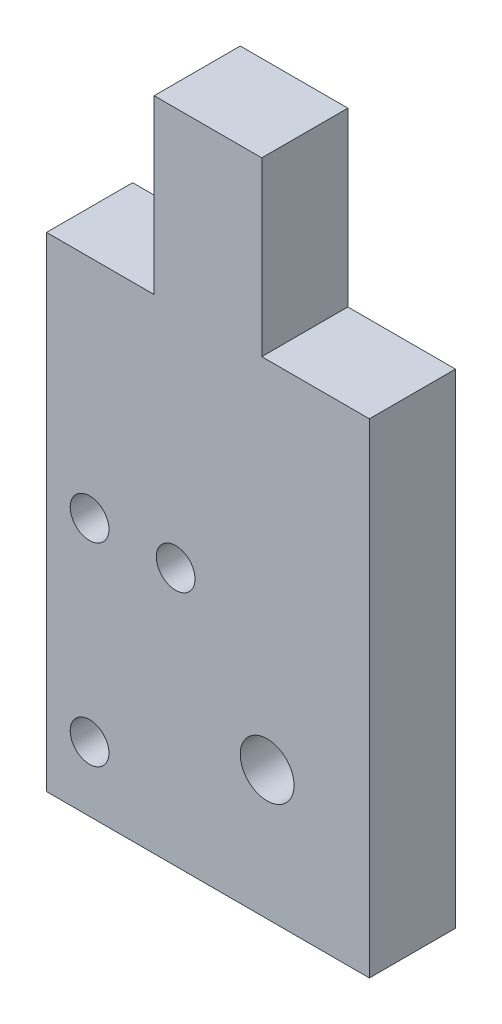
ISO-10303-21;
HEADER;
FILE_DESCRIPTION(('STEP AP214'),'2;1');
FILE_NAME('part.step','',(''),(''),'','','');
FILE_SCHEMA(('AUTOMOTIVE_DESIGN { 1 0 10303 214 1 1 1 1 }'));
ENDSEC;
DATA;
#1=APPLICATION_CONTEXT('core data for automotive mechanical design processes');
#2=APPLICATION_PROTOCOL_DEFINITION('international standard','automotive_design',2000,#1);
#3=PRODUCT_CONTEXT('',#1,'mechanical');
#4=PRODUCT('Part','Part','',(#3));
#5=PRODUCT_RELATED_PRODUCT_CATEGORY('part','',(#4));
#6=PRODUCT_DEFINITION_FORMATION('','',#4);
#7=PRODUCT_DEFINITION_CONTEXT('part definition',#1,'design');
#8=PRODUCT_DEFINITION('design','',#6,#7);
#9=PRODUCT_DEFINITION_SHAPE('','',#8);
#10=(LENGTH_UNIT() NAMED_UNIT(*) SI_UNIT(.MILLI.,.METRE.));
#11=(NAMED_UNIT(*) PLANE_ANGLE_UNIT() SI_UNIT($,.RADIAN.));
#12=(NAMED_UNIT(*) SI_UNIT($,.STERADIAN.) SOLID_ANGLE_UNIT());
#13=UNCERTAINTY_MEASURE_WITH_UNIT(LENGTH_MEASURE(1.E-05),#10,'distance_accuracy_value','');
#14=(GEOMETRIC_REPRESENTATION_CONTEXT(3) GLOBAL_UNCERTAINTY_ASSIGNED_CONTEXT((#13)) GLOBAL_UNIT_ASSIGNED_CONTEXT((#10,
#11,#12)) REPRESENTATION_CONTEXT('',''));
#15=CARTESIAN_POINT('',(0.,0.,0.));
#16=DIRECTION('',(0.,0.,1.));
#17=DIRECTION('',(1.,0.,0.));
#18=AXIS2_PLACEMENT_3D('',#15,#16,#17);
#19=CARTESIAN_POINT('',(0.,0.,10.16));
#20=DIRECTION('',(0.,0.,1.));
#21=DIRECTION('',(1.,0.,0.));
#22=AXIS2_PLACEMENT_3D('',#19,#20,#21);
#23=PLANE('',#22);
#24=CARTESIAN_POINT('',(26.035,15.24,10.16));
#25=DIRECTION('',(0.,0.,1.));
#26=DIRECTION('',(1.,0.,0.));
#27=AXIS2_PLACEMENT_3D('',#24,#25,#26);
#28=CIRCLE('',#27,3.175);
#29=CARTESIAN_POINT('',(29.21,15.24,10.16));
#30=VERTEX_POINT('',#29);
#31=EDGE_CURVE('E188',#30,#30,#28,.T.);
#32=ORIENTED_EDGE('',*,*,#31,.F.);
#33=EDGE_LOOP('',(#32));
#34=FACE_BOUND('',#33,.T.);
#35=CARTESIAN_POINT('',(5.08,7.62,10.16));
#36=DIRECTION('',(0.,0.,1.));
#37=DIRECTION('',(1.,0.,0.));
#38=AXIS2_PLACEMENT_3D('',#35,#36,#37);
#39=CIRCLE('',#38,2.286);
#40=CARTESIAN_POINT('',(7.366,7.62,10.16));
#41=VERTEX_POINT('',#40);
#42=EDGE_CURVE('E134',#41,#41,#39,.T.);
#43=ORIENTED_EDGE('',*,*,#42,.F.);
#44=EDGE_LOOP('',(#43));
#45=FACE_BOUND('',#44,.T.);
#46=DIRECTION('',(0.,-1.,0.));
#47=VECTOR('',#46,1.);
#48=CARTESIAN_POINT('',(0.,57.15,10.16));
#49=LINE('',#48,#47);
#50=CARTESIAN_POINT('',(0.,57.15,10.16));
#51=VERTEX_POINT('',#50);
#52=CARTESIAN_POINT('',(0.,0.,10.16));
#53=VERTEX_POINT('',#52);
#54=EDGE_CURVE('E145',#51,#53,#49,.T.);
#55=ORIENTED_EDGE('',*,*,#54,.T.);
#56=DIRECTION('',(1.,0.,0.));
#57=VECTOR('',#56,1.);
#58=CARTESIAN_POINT('',(0.,0.,10.16));
#59=LINE('',#58,#57);
#60=CARTESIAN_POINT('',(38.1,0.,10.16));
#61=VERTEX_POINT('',#60);
#62=EDGE_CURVE('E93',#53,#61,#59,.T.);
#63=ORIENTED_EDGE('',*,*,#62,.T.);
#64=DIRECTION('',(0.,1.,0.));
#65=VECTOR('',#64,1.);
#66=CARTESIAN_POINT('',(38.1,57.15,10.16));
#67=LINE('',#66,#65);
#68=CARTESIAN_POINT('',(38.1,57.15,10.16));
#69=VERTEX_POINT('',#68);
#70=EDGE_CURVE('E160',#61,#69,#67,.T.);
#71=ORIENTED_EDGE('',*,*,#70,.T.);
#72=DIRECTION('',(-1.,0.,0.));
#73=VECTOR('',#72,1.);
#74=CARTESIAN_POINT('',(25.4,57.15,10.16));
#75=LINE('',#74,#73);
#76=CARTESIAN_POINT('',(25.4,57.15,10.16));
#77=VERTEX_POINT('',#76);
#78=EDGE_CURVE('E173',#69,#77,#75,.T.);
#79=ORIENTED_EDGE('',*,*,#78,.T.);
#80=DIRECTION('',(0.,1.,0.));
#81=VECTOR('',#80,1.);
#82=CARTESIAN_POINT('',(25.4,77.47,10.16));
#83=LINE('',#82,#81);
#84=CARTESIAN_POINT('',(25.4,77.47,10.16));
#85=VERTEX_POINT('',#84);
#86=EDGE_CURVE('E112',#77,#85,#83,.T.);
#87=ORIENTED_EDGE('',*,*,#86,.T.);
#88=DIRECTION('',(-1.,0.,0.));
#89=VECTOR('',#88,1.);
#90=CARTESIAN_POINT('',(12.7,77.47,10.16));
#91=LINE('',#90,#89);
#92=CARTESIAN_POINT('',(12.7,77.47,10.16));
#93=VERTEX_POINT('',#92);
#94=EDGE_CURVE('E106',#85,#93,#91,.T.);
#95=ORIENTED_EDGE('',*,*,#94,.T.);
#96=DIRECTION('',(0.,-1.,0.));
#97=VECTOR('',#96,1.);
#98=CARTESIAN_POINT('',(12.7,57.15,10.16));
#99=LINE('',#98,#97);
#100=CARTESIAN_POINT('',(12.7,57.15,10.16));
#101=VERTEX_POINT('',#100);
#102=EDGE_CURVE('E110',#93,#101,#99,.T.);
#103=ORIENTED_EDGE('',*,*,#102,.T.);
#104=DIRECTION('',(-1.,0.,0.));
#105=VECTOR('',#104,1.);
#106=CARTESIAN_POINT('',(0.,57.15,10.16));
#107=LINE('',#106,#105);
#108=EDGE_CURVE('E50',#101,#51,#107,.T.);
#109=ORIENTED_EDGE('',*,*,#108,.T.);
#110=EDGE_LOOP('',(#55,#63,#71,#79,#87,#95,#103,#109));
#111=FACE_BOUND('',#110,.T.);
#112=CARTESIAN_POINT('',(5.08,30.48,10.16));
#113=DIRECTION('',(0.,0.,1.));
#114=DIRECTION('',(1.,0.,0.));
#115=AXIS2_PLACEMENT_3D('',#112,#113,#114);
#116=CIRCLE('',#115,2.286);
#117=CARTESIAN_POINT('',(7.366,30.48,10.16));
#118=VERTEX_POINT('',#117);
#119=EDGE_CURVE('E182',#118,#118,#116,.T.);
#120=ORIENTED_EDGE('',*,*,#119,.F.);
#121=EDGE_LOOP('',(#120));
#122=FACE_BOUND('',#121,.T.);
#123=CARTESIAN_POINT('',(15.24,30.48,10.16));
#124=DIRECTION('',(0.,0.,1.));
#125=DIRECTION('',(1.,0.,0.));
#126=AXIS2_PLACEMENT_3D('',#123,#124,#125);
#127=CIRCLE('',#126,2.286);
#128=CARTESIAN_POINT('',(17.526,30.48,10.16));
#129=VERTEX_POINT('',#128);
#130=EDGE_CURVE('E194',#129,#129,#127,.T.);
#131=ORIENTED_EDGE('',*,*,#130,.F.);
#132=EDGE_LOOP('',(#131));
#133=FACE_BOUND('',#132,.T.);
#134=ADVANCED_FACE('F33',(#34,#45,#111,#122,#133),#23,.T.);
#135=CARTESIAN_POINT('',(0.,0.,0.));
#136=DIRECTION('',(0.,0.,1.));
#137=DIRECTION('',(1.,0.,0.));
#138=AXIS2_PLACEMENT_3D('',#135,#136,#137);
#139=PLANE('',#138);
#140=DIRECTION('',(0.,-1.,0.));
#141=VECTOR('',#140,1.);
#142=CARTESIAN_POINT('',(0.,57.15,0.));
#143=LINE('',#142,#141);
#144=CARTESIAN_POINT('',(0.,57.15,0.));
#145=VERTEX_POINT('',#144);
#146=CARTESIAN_POINT('',(0.,0.,0.));
#147=VERTEX_POINT('',#146);
#148=EDGE_CURVE('E130',#145,#147,#143,.T.);
#149=ORIENTED_EDGE('',*,*,#148,.F.);
#150=DIRECTION('',(-1.,0.,0.));
#151=VECTOR('',#150,1.);
#152=CARTESIAN_POINT('',(0.,57.15,0.));
#153=LINE('',#152,#151);
#154=CARTESIAN_POINT('',(12.7,57.15,0.));
#155=VERTEX_POINT('',#154);
#156=EDGE_CURVE('E85',#155,#145,#153,.T.);
#157=ORIENTED_EDGE('',*,*,#156,.F.);
#158=DIRECTION('',(0.,-1.,0.));
#159=VECTOR('',#158,1.);
#160=CARTESIAN_POINT('',(12.7,57.15,0.));
#161=LINE('',#160,#159);
#162=CARTESIAN_POINT('',(12.7,77.47,0.));
#163=VERTEX_POINT('',#162);
#164=EDGE_CURVE('E79',#163,#155,#161,.T.);
#165=ORIENTED_EDGE('',*,*,#164,.F.);
#166=DIRECTION('',(-1.,0.,0.));
#167=VECTOR('',#166,1.);
#168=CARTESIAN_POINT('',(12.7,77.47,0.));
#169=LINE('',#168,#167);
#170=CARTESIAN_POINT('',(25.4,77.47,0.));
#171=VERTEX_POINT('',#170);
#172=EDGE_CURVE('E120',#171,#163,#169,.T.);
#173=ORIENTED_EDGE('',*,*,#172,.F.);
#174=DIRECTION('',(0.,1.,0.));
#175=VECTOR('',#174,1.);
#176=CARTESIAN_POINT('',(25.4,77.47,0.));
#177=LINE('',#176,#175);
#178=CARTESIAN_POINT('',(25.4,57.15,0.));
#179=VERTEX_POINT('',#178);
#180=EDGE_CURVE('E140',#179,#171,#177,.T.);
#181=ORIENTED_EDGE('',*,*,#180,.F.);
#182=DIRECTION('',(-1.,0.,0.));
#183=VECTOR('',#182,1.);
#184=CARTESIAN_POINT('',(25.4,57.15,0.));
#185=LINE('',#184,#183);
#186=CARTESIAN_POINT('',(38.1,57.15,0.));
#187=VERTEX_POINT('',#186);
#188=EDGE_CURVE('E138',#187,#179,#185,.T.);
#189=ORIENTED_EDGE('',*,*,#188,.F.);
#190=DIRECTION('',(0.,1.,0.));
#191=VECTOR('',#190,1.);
#192=CARTESIAN_POINT('',(38.1,57.15,0.));
#193=LINE('',#192,#191);
#194=CARTESIAN_POINT('',(38.1,0.,0.));
#195=VERTEX_POINT('',#194);
#196=EDGE_CURVE('E136',#195,#187,#193,.T.);
#197=ORIENTED_EDGE('',*,*,#196,.F.);
#198=DIRECTION('',(1.,0.,0.));
#199=VECTOR('',#198,1.);
#200=CARTESIAN_POINT('',(0.,0.,0.));
#201=LINE('',#200,#199);
#202=EDGE_CURVE('E133',#147,#195,#201,.T.);
#203=ORIENTED_EDGE('',*,*,#202,.F.);
#204=EDGE_LOOP('',(#149,#157,#165,#173,#181,#189,#197,#203));
#205=FACE_BOUND('',#204,.T.);
#206=CARTESIAN_POINT('',(5.08,7.62,0.));
#207=DIRECTION('',(0.,0.,1.));
#208=DIRECTION('',(1.,0.,0.));
#209=AXIS2_PLACEMENT_3D('',#206,#207,#208);
#210=CIRCLE('',#209,2.286);
#211=CARTESIAN_POINT('',(7.366,7.62,0.));
#212=VERTEX_POINT('',#211);
#213=EDGE_CURVE('E179',#212,#212,#210,.T.);
#214=ORIENTED_EDGE('',*,*,#213,.T.);
#215=EDGE_LOOP('',(#214));
#216=FACE_BOUND('',#215,.T.);
#217=CARTESIAN_POINT('',(5.08,30.48,0.));
#218=DIRECTION('',(0.,0.,1.));
#219=DIRECTION('',(1.,0.,0.));
#220=AXIS2_PLACEMENT_3D('',#217,#218,#219);
#221=CIRCLE('',#220,2.286);
#222=CARTESIAN_POINT('',(7.366,30.48,0.));
#223=VERTEX_POINT('',#222);
#224=EDGE_CURVE('E185',#223,#223,#221,.T.);
#225=ORIENTED_EDGE('',*,*,#224,.T.);
#226=EDGE_LOOP('',(#225));
#227=FACE_BOUND('',#226,.T.);
#228=CARTESIAN_POINT('',(26.035,15.24,0.));
#229=DIRECTION('',(0.,0.,1.));
#230=DIRECTION('',(1.,0.,0.));
#231=AXIS2_PLACEMENT_3D('',#228,#229,#230);
#232=CIRCLE('',#231,3.175);
#233=CARTESIAN_POINT('',(29.21,15.24,0.));
#234=VERTEX_POINT('',#233);
#235=EDGE_CURVE('E191',#234,#234,#232,.T.);
#236=ORIENTED_EDGE('',*,*,#235,.T.);
#237=EDGE_LOOP('',(#236));
#238=FACE_BOUND('',#237,.T.);
#239=CARTESIAN_POINT('',(15.24,30.48,0.));
#240=DIRECTION('',(0.,0.,1.));
#241=DIRECTION('',(1.,0.,0.));
#242=AXIS2_PLACEMENT_3D('',#239,#240,#241);
#243=CIRCLE('',#242,2.286);
#244=CARTESIAN_POINT('',(17.526,30.48,0.));
#245=VERTEX_POINT('',#244);
#246=EDGE_CURVE('E197',#245,#245,#243,.T.);
#247=ORIENTED_EDGE('',*,*,#246,.T.);
#248=EDGE_LOOP('',(#247));
#249=FACE_BOUND('',#248,.T.);
#250=ADVANCED_FACE('F164',(#205,#216,#227,#238,#249),#139,.F.);
#251=CARTESIAN_POINT('',(0.,57.15,10.16));
#252=DIRECTION('',(1.,0.,0.));
#253=DIRECTION('',(0.,0.,-1.));
#254=AXIS2_PLACEMENT_3D('',#251,#252,#253);
#255=PLANE('',#254);
#256=ORIENTED_EDGE('',*,*,#148,.T.);
#257=DIRECTION('',(0.,0.,-1.));
#258=VECTOR('',#257,1.);
#259=CARTESIAN_POINT('',(0.,0.,10.16));
#260=LINE('',#259,#258);
#261=EDGE_CURVE('E11',#53,#147,#260,.T.);
#262=ORIENTED_EDGE('',*,*,#261,.F.);
#263=ORIENTED_EDGE('',*,*,#54,.F.);
#264=DIRECTION('',(0.,0.,-1.));
#265=VECTOR('',#264,1.);
#266=CARTESIAN_POINT('',(0.,57.15,10.16));
#267=LINE('',#266,#265);
#268=EDGE_CURVE('E126',#51,#145,#267,.T.);
#269=ORIENTED_EDGE('',*,*,#268,.T.);
#270=EDGE_LOOP('',(#256,#262,#263,#269));
#271=FACE_BOUND('',#270,.T.);
#272=ADVANCED_FACE('F35',(#271),#255,.F.);
#273=CARTESIAN_POINT('',(0.,0.,10.16));
#274=DIRECTION('',(0.,1.,0.));
#275=DIRECTION('',(0.,0.,1.));
#276=AXIS2_PLACEMENT_3D('',#273,#274,#275);
#277=PLANE('',#276);
#278=ORIENTED_EDGE('',*,*,#202,.T.);
#279=DIRECTION('',(0.,0.,-1.));
#280=VECTOR('',#279,1.);
#281=CARTESIAN_POINT('',(38.1,0.,10.16));
#282=LINE('',#281,#280);
#283=EDGE_CURVE('E42',#61,#195,#282,.T.);
#284=ORIENTED_EDGE('',*,*,#283,.F.);
#285=ORIENTED_EDGE('',*,*,#62,.F.);
#286=ORIENTED_EDGE('',*,*,#261,.T.);
#287=EDGE_LOOP('',(#278,#284,#285,#286));
#288=FACE_BOUND('',#287,.T.);
#289=ADVANCED_FACE('F231',(#288),#277,.F.);
#290=CARTESIAN_POINT('',(38.1,57.15,10.16));
#291=DIRECTION('',(-1.,0.,0.));
#292=DIRECTION('',(0.,0.,1.));
#293=AXIS2_PLACEMENT_3D('',#290,#291,#292);
#294=PLANE('',#293);
#295=ORIENTED_EDGE('',*,*,#196,.T.);
#296=DIRECTION('',(0.,0.,-1.));
#297=VECTOR('',#296,1.);
#298=CARTESIAN_POINT('',(38.1,57.15,10.16));
#299=LINE('',#298,#297);
#300=EDGE_CURVE('E152',#69,#187,#299,.T.);
#301=ORIENTED_EDGE('',*,*,#300,.F.);
#302=ORIENTED_EDGE('',*,*,#70,.F.);
#303=ORIENTED_EDGE('',*,*,#283,.T.);
#304=EDGE_LOOP('',(#295,#301,#302,#303));
#305=FACE_BOUND('',#304,.T.);
#306=ADVANCED_FACE('F158',(#305),#294,.F.);
#307=CARTESIAN_POINT('',(25.4,57.15,10.16));
#308=DIRECTION('',(0.,-1.,0.));
#309=DIRECTION('',(1.,0.,0.));
#310=AXIS2_PLACEMENT_3D('',#307,#308,#309);
#311=PLANE('',#310);
#312=ORIENTED_EDGE('',*,*,#188,.T.);
#313=DIRECTION('',(0.,0.,-1.));
#314=VECTOR('',#313,1.);
#315=CARTESIAN_POINT('',(25.4,57.15,10.16));
#316=LINE('',#315,#314);
#317=EDGE_CURVE('E149',#77,#179,#316,.T.);
#318=ORIENTED_EDGE('',*,*,#317,.F.);
#319=ORIENTED_EDGE('',*,*,#78,.F.);
#320=ORIENTED_EDGE('',*,*,#300,.T.);
#321=EDGE_LOOP('',(#312,#318,#319,#320));
#322=FACE_BOUND('',#321,.T.);
#323=ADVANCED_FACE('F169',(#322),#311,.F.);
#324=CARTESIAN_POINT('',(25.4,77.47,10.16));
#325=DIRECTION('',(-1.,0.,0.));
#326=DIRECTION('',(0.,-1.,0.));
#327=AXIS2_PLACEMENT_3D('',#324,#325,#326);
#328=PLANE('',#327);
#329=ORIENTED_EDGE('',*,*,#180,.T.);
#330=DIRECTION('',(0.,0.,-1.));
#331=VECTOR('',#330,1.);
#332=CARTESIAN_POINT('',(25.4,77.47,10.16));
#333=LINE('',#332,#331);
#334=EDGE_CURVE('E121',#85,#171,#333,.T.);
#335=ORIENTED_EDGE('',*,*,#334,.F.);
#336=ORIENTED_EDGE('',*,*,#86,.F.);
#337=ORIENTED_EDGE('',*,*,#317,.T.);
#338=EDGE_LOOP('',(#329,#335,#336,#337));
#339=FACE_BOUND('',#338,.T.);
#340=ADVANCED_FACE('F172',(#339),#328,.F.);
#341=CARTESIAN_POINT('',(12.7,77.47,10.16));
#342=DIRECTION('',(0.,-1.,0.));
#343=DIRECTION('',(0.,0.,-1.));
#344=AXIS2_PLACEMENT_3D('',#341,#342,#343);
#345=PLANE('',#344);
#346=ORIENTED_EDGE('',*,*,#172,.T.);
#347=DIRECTION('',(0.,0.,-1.));
#348=VECTOR('',#347,1.);
#349=CARTESIAN_POINT('',(12.7,77.47,10.16));
#350=LINE('',#349,#348);
#351=EDGE_CURVE('E117',#93,#163,#350,.T.);
#352=ORIENTED_EDGE('',*,*,#351,.F.);
#353=ORIENTED_EDGE('',*,*,#94,.F.);
#354=ORIENTED_EDGE('',*,*,#334,.T.);
#355=EDGE_LOOP('',(#346,#352,#353,#354));
#356=FACE_BOUND('',#355,.T.);
#357=ADVANCED_FACE('F118',(#356),#345,.F.);
#358=CARTESIAN_POINT('',(12.7,57.15,10.16));
#359=DIRECTION('',(1.,0.,0.));
#360=DIRECTION('',(0.,0.,-1.));
#361=AXIS2_PLACEMENT_3D('',#358,#359,#360);
#362=PLANE('',#361);
#363=ORIENTED_EDGE('',*,*,#164,.T.);
#364=DIRECTION('',(0.,0.,-1.));
#365=VECTOR('',#364,1.);
#366=CARTESIAN_POINT('',(12.7,57.15,10.16));
#367=LINE('',#366,#365);
#368=EDGE_CURVE('E122',#101,#155,#367,.T.);
#369=ORIENTED_EDGE('',*,*,#368,.F.);
#370=ORIENTED_EDGE('',*,*,#102,.F.);
#371=ORIENTED_EDGE('',*,*,#351,.T.);
#372=EDGE_LOOP('',(#363,#369,#370,#371));
#373=FACE_BOUND('',#372,.T.);
#374=ADVANCED_FACE('F124',(#373),#362,.F.);
#375=CARTESIAN_POINT('',(0.,57.15,10.16));
#376=DIRECTION('',(0.,-1.,0.));
#377=DIRECTION('',(0.,0.,-1.));
#378=AXIS2_PLACEMENT_3D('',#375,#376,#377);
#379=PLANE('',#378);
#380=ORIENTED_EDGE('',*,*,#156,.T.);
#381=ORIENTED_EDGE('',*,*,#268,.F.);
#382=ORIENTED_EDGE('',*,*,#108,.F.);
#383=ORIENTED_EDGE('',*,*,#368,.T.);
#384=EDGE_LOOP('',(#380,#381,#382,#383));
#385=FACE_BOUND('',#384,.T.);
#386=ADVANCED_FACE('F219',(#385),#379,.F.);
#387=CARTESIAN_POINT('',(5.08,7.62,10.16));
#388=DIRECTION('',(0.,0.,-1.));
#389=DIRECTION('',(-1.,0.,0.));
#390=AXIS2_PLACEMENT_3D('',#387,#388,#389);
#391=CYLINDRICAL_SURFACE('',#390,2.286);
#392=ORIENTED_EDGE('',*,*,#42,.T.);
#393=EDGE_LOOP('',(#392));
#394=FACE_BOUND('',#393,.T.);
#395=ORIENTED_EDGE('',*,*,#213,.F.);
#396=EDGE_LOOP('',(#395));
#397=FACE_BOUND('',#396,.T.);
#398=ADVANCED_FACE('F216',(#394,#397),#391,.F.);
#399=CARTESIAN_POINT('',(5.08,30.48,10.16));
#400=DIRECTION('',(0.,0.,-1.));
#401=DIRECTION('',(-1.,0.,0.));
#402=AXIS2_PLACEMENT_3D('',#399,#400,#401);
#403=CYLINDRICAL_SURFACE('',#402,2.286);
#404=ORIENTED_EDGE('',*,*,#119,.T.);
#405=EDGE_LOOP('',(#404));
#406=FACE_BOUND('',#405,.T.);
#407=ORIENTED_EDGE('',*,*,#224,.F.);
#408=EDGE_LOOP('',(#407));
#409=FACE_BOUND('',#408,.T.);
#410=ADVANCED_FACE('F295',(#406,#409),#403,.F.);
#411=CARTESIAN_POINT('',(26.035,15.24,10.16));
#412=DIRECTION('',(0.,0.,-1.));
#413=DIRECTION('',(-1.,0.,0.));
#414=AXIS2_PLACEMENT_3D('',#411,#412,#413);
#415=CYLINDRICAL_SURFACE('',#414,3.175);
#416=ORIENTED_EDGE('',*,*,#31,.T.);
#417=EDGE_LOOP('',(#416));
#418=FACE_BOUND('',#417,.T.);
#419=ORIENTED_EDGE('',*,*,#235,.F.);
#420=EDGE_LOOP('',(#419));
#421=FACE_BOUND('',#420,.T.);
#422=ADVANCED_FACE('F303',(#418,#421),#415,.F.);
#423=CARTESIAN_POINT('',(15.24,30.48,10.16));
#424=DIRECTION('',(0.,0.,-1.));
#425=DIRECTION('',(-1.,0.,0.));
#426=AXIS2_PLACEMENT_3D('',#423,#424,#425);
#427=CYLINDRICAL_SURFACE('',#426,2.286);
#428=ORIENTED_EDGE('',*,*,#130,.T.);
#429=EDGE_LOOP('',(#428));
#430=FACE_BOUND('',#429,.T.);
#431=ORIENTED_EDGE('',*,*,#246,.F.);
#432=EDGE_LOOP('',(#431));
#433=FACE_BOUND('',#432,.T.);
#434=ADVANCED_FACE('F203',(#430,#433),#427,.F.);
#435=CLOSED_SHELL('',(#134,#250,#272,#289,#306,#323,#340,#357,#374,#386,#398,#410,#422,#434));
#436=MANIFOLD_SOLID_BREP('B2',#435);
#437=ADVANCED_BREP_SHAPE_REPRESENTATION('',(#18,#436),#14);
#438=SHAPE_DEFINITION_REPRESENTATION(#9,#437);
ENDSEC;
END-ISO-10303-21;
